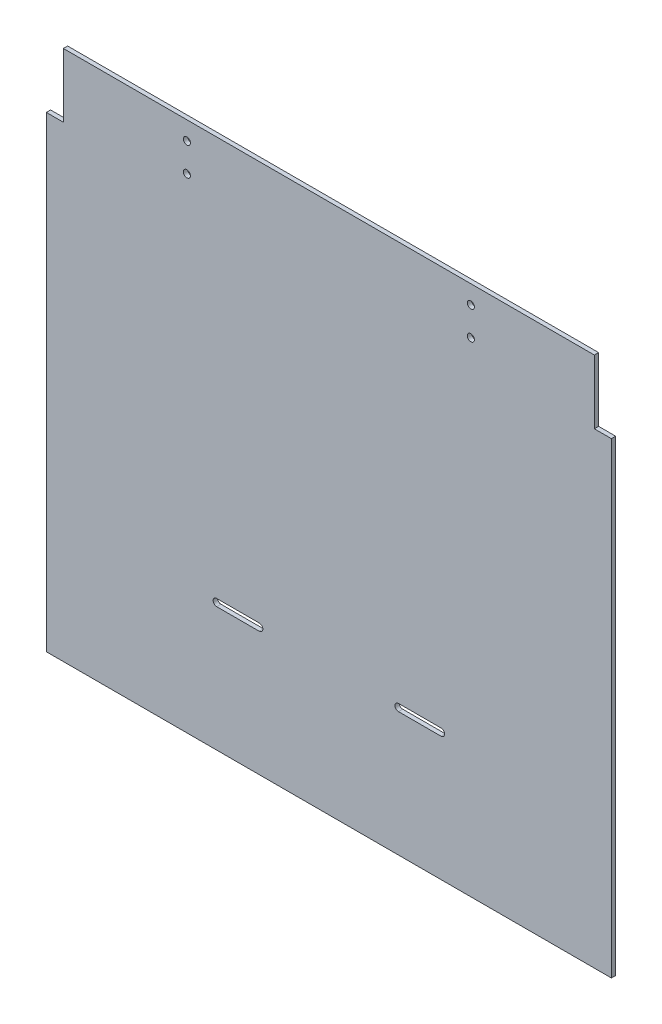
ISO-10303-21;
HEADER;
FILE_DESCRIPTION(('STEP AP214'),'2;1');
FILE_NAME('part.step','',(''),(''),'','','');
FILE_SCHEMA(('AUTOMOTIVE_DESIGN { 1 0 10303 214 1 1 1 1 }'));
ENDSEC;
DATA;
#1=APPLICATION_CONTEXT('core data for automotive mechanical design processes');
#2=APPLICATION_PROTOCOL_DEFINITION('international standard','automotive_design',2000,#1);
#3=PRODUCT_CONTEXT('',#1,'mechanical');
#4=PRODUCT('Part','Part','',(#3));
#5=PRODUCT_RELATED_PRODUCT_CATEGORY('part','',(#4));
#6=PRODUCT_DEFINITION_FORMATION('','',#4);
#7=PRODUCT_DEFINITION_CONTEXT('part definition',#1,'design');
#8=PRODUCT_DEFINITION('design','',#6,#7);
#9=PRODUCT_DEFINITION_SHAPE('','',#8);
#10=(LENGTH_UNIT() NAMED_UNIT(*) SI_UNIT(.MILLI.,.METRE.));
#11=(NAMED_UNIT(*) PLANE_ANGLE_UNIT() SI_UNIT($,.RADIAN.));
#12=(NAMED_UNIT(*) SI_UNIT($,.STERADIAN.) SOLID_ANGLE_UNIT());
#13=UNCERTAINTY_MEASURE_WITH_UNIT(LENGTH_MEASURE(1.E-05),#10,'distance_accuracy_value','');
#14=(GEOMETRIC_REPRESENTATION_CONTEXT(3) GLOBAL_UNCERTAINTY_ASSIGNED_CONTEXT((#13)) GLOBAL_UNIT_ASSIGNED_CONTEXT((#10,
#11,#12)) REPRESENTATION_CONTEXT('',''));
#15=CARTESIAN_POINT('',(0.,0.,0.));
#16=DIRECTION('',(0.,0.,1.));
#17=DIRECTION('',(1.,0.,0.));
#18=AXIS2_PLACEMENT_3D('',#15,#16,#17);
#19=CARTESIAN_POINT('',(199.,-187.,3.));
#20=DIRECTION('',(-1.,0.,0.));
#21=DIRECTION('',(0.,0.,1.));
#22=AXIS2_PLACEMENT_3D('',#19,#20,#21);
#23=PLANE('',#22);
#24=DIRECTION('',(0.,1.,0.));
#25=VECTOR('',#24,1.);
#26=CARTESIAN_POINT('',(199.,-187.,0.));
#27=LINE('',#26,#25);
#28=CARTESIAN_POINT('',(199.,-187.,0.));
#29=VERTEX_POINT('',#28);
#30=CARTESIAN_POINT('',(199.,142.,0.));
#31=VERTEX_POINT('',#30);
#32=EDGE_CURVE('E237',#29,#31,#27,.T.);
#33=ORIENTED_EDGE('',*,*,#32,.T.);
#34=DIRECTION('',(0.,0.,-1.));
#35=VECTOR('',#34,1.);
#36=CARTESIAN_POINT('',(199.,142.,3.001));
#37=LINE('',#36,#35);
#38=CARTESIAN_POINT('',(199.,142.,3.));
#39=VERTEX_POINT('',#38);
#40=EDGE_CURVE('E228',#39,#31,#37,.T.);
#41=ORIENTED_EDGE('',*,*,#40,.F.);
#42=DIRECTION('',(0.,1.,0.));
#43=VECTOR('',#42,1.);
#44=CARTESIAN_POINT('',(199.,-187.,3.));
#45=LINE('',#44,#43);
#46=CARTESIAN_POINT('',(199.,-187.,3.));
#47=VERTEX_POINT('',#46);
#48=EDGE_CURVE('E277',#47,#39,#45,.T.);
#49=ORIENTED_EDGE('',*,*,#48,.F.);
#50=DIRECTION('',(0.,0.,-1.));
#51=VECTOR('',#50,1.);
#52=CARTESIAN_POINT('',(199.,-187.,3.));
#53=LINE('',#52,#51);
#54=EDGE_CURVE('E40',#47,#29,#53,.T.);
#55=ORIENTED_EDGE('',*,*,#54,.T.);
#56=EDGE_LOOP('',(#33,#41,#49,#55));
#57=FACE_BOUND('',#56,.T.);
#58=ADVANCED_FACE('F33',(#57),#23,.F.);
#59=CARTESIAN_POINT('',(-199.,187.,3.));
#60=DIRECTION('',(0.,-1.,0.));
#61=DIRECTION('',(0.,0.,-1.));
#62=AXIS2_PLACEMENT_3D('',#59,#60,#61);
#63=PLANE('',#62);
#64=DIRECTION('',(-1.,0.,0.));
#65=VECTOR('',#64,1.);
#66=CARTESIAN_POINT('',(-199.,187.,3.));
#67=LINE('',#66,#65);
#68=CARTESIAN_POINT('',(187.,187.,3.));
#69=VERTEX_POINT('',#68);
#70=CARTESIAN_POINT('',(-187.,187.,3.));
#71=VERTEX_POINT('',#70);
#72=EDGE_CURVE('E280',#69,#71,#67,.T.);
#73=ORIENTED_EDGE('',*,*,#72,.F.);
#74=DIRECTION('',(0.,0.,-1.));
#75=VECTOR('',#74,1.);
#76=CARTESIAN_POINT('',(187.,187.,3.001));
#77=LINE('',#76,#75);
#78=CARTESIAN_POINT('',(187.,187.,0.));
#79=VERTEX_POINT('',#78);
#80=EDGE_CURVE('E229',#69,#79,#77,.T.);
#81=ORIENTED_EDGE('',*,*,#80,.T.);
#82=DIRECTION('',(-1.,0.,0.));
#83=VECTOR('',#82,1.);
#84=CARTESIAN_POINT('',(-199.,187.,0.));
#85=LINE('',#84,#83);
#86=CARTESIAN_POINT('',(-187.,187.,0.));
#87=VERTEX_POINT('',#86);
#88=EDGE_CURVE('E290',#79,#87,#85,.T.);
#89=ORIENTED_EDGE('',*,*,#88,.T.);
#90=DIRECTION('',(0.,0.,-1.));
#91=VECTOR('',#90,1.);
#92=CARTESIAN_POINT('',(-187.,187.,3.001));
#93=LINE('',#92,#91);
#94=EDGE_CURVE('E269',#71,#87,#93,.T.);
#95=ORIENTED_EDGE('',*,*,#94,.F.);
#96=EDGE_LOOP('',(#73,#81,#89,#95));
#97=FACE_BOUND('',#96,.T.);
#98=ADVANCED_FACE('F332',(#97),#63,.F.);
#99=CARTESIAN_POINT('',(-199.,-187.,3.));
#100=DIRECTION('',(1.,0.,0.));
#101=DIRECTION('',(0.,0.,-1.));
#102=AXIS2_PLACEMENT_3D('',#99,#100,#101);
#103=PLANE('',#102);
#104=DIRECTION('',(0.,-1.,0.));
#105=VECTOR('',#104,1.);
#106=CARTESIAN_POINT('',(-199.,-187.,3.));
#107=LINE('',#106,#105);
#108=CARTESIAN_POINT('',(-199.,142.,3.));
#109=VERTEX_POINT('',#108);
#110=CARTESIAN_POINT('',(-199.,-187.,3.));
#111=VERTEX_POINT('',#110);
#112=EDGE_CURVE('E284',#109,#111,#107,.T.);
#113=ORIENTED_EDGE('',*,*,#112,.F.);
#114=DIRECTION('',(0.,0.,-1.));
#115=VECTOR('',#114,1.);
#116=CARTESIAN_POINT('',(-199.,142.,3.001));
#117=LINE('',#116,#115);
#118=CARTESIAN_POINT('',(-199.,142.,0.));
#119=VERTEX_POINT('',#118);
#120=EDGE_CURVE('E270',#109,#119,#117,.T.);
#121=ORIENTED_EDGE('',*,*,#120,.T.);
#122=DIRECTION('',(0.,-1.,0.));
#123=VECTOR('',#122,1.);
#124=CARTESIAN_POINT('',(-199.,-187.,0.));
#125=LINE('',#124,#123);
#126=CARTESIAN_POINT('',(-199.,-187.,0.));
#127=VERTEX_POINT('',#126);
#128=EDGE_CURVE('E293',#119,#127,#125,.T.);
#129=ORIENTED_EDGE('',*,*,#128,.T.);
#130=DIRECTION('',(0.,0.,-1.));
#131=VECTOR('',#130,1.);
#132=CARTESIAN_POINT('',(-199.,-187.,3.));
#133=LINE('',#132,#131);
#134=EDGE_CURVE('E11',#111,#127,#133,.T.);
#135=ORIENTED_EDGE('',*,*,#134,.F.);
#136=EDGE_LOOP('',(#113,#121,#129,#135));
#137=FACE_BOUND('',#136,.T.);
#138=ADVANCED_FACE('F321',(#137),#103,.F.);
#139=CARTESIAN_POINT('',(-199.,-187.,3.));
#140=DIRECTION('',(0.,1.,0.));
#141=DIRECTION('',(0.,0.,1.));
#142=AXIS2_PLACEMENT_3D('',#139,#140,#141);
#143=PLANE('',#142);
#144=DIRECTION('',(1.,0.,0.));
#145=VECTOR('',#144,1.);
#146=CARTESIAN_POINT('',(-199.,-187.,0.));
#147=LINE('',#146,#145);
#148=EDGE_CURVE('E281',#127,#29,#147,.T.);
#149=ORIENTED_EDGE('',*,*,#148,.T.);
#150=ORIENTED_EDGE('',*,*,#54,.F.);
#151=DIRECTION('',(1.,0.,0.));
#152=VECTOR('',#151,1.);
#153=CARTESIAN_POINT('',(-199.,-187.,3.));
#154=LINE('',#153,#152);
#155=EDGE_CURVE('E286',#111,#47,#154,.T.);
#156=ORIENTED_EDGE('',*,*,#155,.F.);
#157=ORIENTED_EDGE('',*,*,#134,.T.);
#158=EDGE_LOOP('',(#149,#150,#156,#157));
#159=FACE_BOUND('',#158,.T.);
#160=ADVANCED_FACE('F319',(#159),#143,.F.);
#161=CARTESIAN_POINT('',(0.,0.,3.));
#162=DIRECTION('',(0.,0.,-1.));
#163=DIRECTION('',(-1.,0.,0.));
#164=AXIS2_PLACEMENT_3D('',#161,#162,#163);
#165=PLANE('',#164);
#166=CARTESIAN_POINT('',(-79.0000000000001,-97.0000000000001,3.));
#167=DIRECTION('',(0.,0.,-1.));
#168=DIRECTION('',(-1.,0.,0.));
#169=AXIS2_PLACEMENT_3D('',#166,#167,#168);
#170=CIRCLE('',#169,2.5);
#171=CARTESIAN_POINT('',(-79.0000000000001,-99.5000000000001,3.));
#172=VERTEX_POINT('',#171);
#173=CARTESIAN_POINT('',(-79.0000000000001,-94.5000000000001,3.));
#174=VERTEX_POINT('',#173);
#175=EDGE_CURVE('E47',#172,#174,#170,.T.);
#176=ORIENTED_EDGE('',*,*,#175,.T.);
#177=DIRECTION('',(1.,0.,0.));
#178=VECTOR('',#177,1.);
#179=CARTESIAN_POINT('',(-49.0000000000001,-94.5000000000001,3.));
#180=LINE('',#179,#178);
#181=CARTESIAN_POINT('',(-49.0000000000001,-94.5000000000001,3.));
#182=VERTEX_POINT('',#181);
#183=EDGE_CURVE('E166',#174,#182,#180,.T.);
#184=ORIENTED_EDGE('',*,*,#183,.T.);
#185=CARTESIAN_POINT('',(-49.0000000000001,-97.0000000000001,3.));
#186=DIRECTION('',(0.,0.,-1.));
#187=DIRECTION('',(-1.,0.,0.));
#188=AXIS2_PLACEMENT_3D('',#185,#186,#187);
#189=CIRCLE('',#188,2.5);
#190=CARTESIAN_POINT('',(-49.0000000000001,-99.5000000000001,3.));
#191=VERTEX_POINT('',#190);
#192=EDGE_CURVE('E156',#182,#191,#189,.T.);
#193=ORIENTED_EDGE('',*,*,#192,.T.);
#194=DIRECTION('',(-1.,0.,0.));
#195=VECTOR('',#194,1.);
#196=CARTESIAN_POINT('',(-49.0000000000001,-99.5000000000001,3.));
#197=LINE('',#196,#195);
#198=EDGE_CURVE('E148',#191,#172,#197,.T.);
#199=ORIENTED_EDGE('',*,*,#198,.T.);
#200=EDGE_LOOP('',(#176,#184,#193,#199));
#201=FACE_BOUND('',#200,.T.);
#202=CARTESIAN_POINT('',(79.0000000000007,-97.0000000000005,3.));
#203=DIRECTION('',(0.,0.,-1.));
#204=DIRECTION('',(1.,0.,0.));
#205=AXIS2_PLACEMENT_3D('',#202,#203,#204);
#206=CIRCLE('',#205,2.5);
#207=CARTESIAN_POINT('',(79.0000000000008,-94.5000000000005,3.));
#208=VERTEX_POINT('',#207);
#209=CARTESIAN_POINT('',(79.0000000000007,-99.5000000000005,3.));
#210=VERTEX_POINT('',#209);
#211=EDGE_CURVE('E55',#208,#210,#206,.T.);
#212=ORIENTED_EDGE('',*,*,#211,.T.);
#213=DIRECTION('',(-1.,0.,0.));
#214=VECTOR('',#213,1.);
#215=CARTESIAN_POINT('',(49.0000000000007,-99.5000000000005,3.));
#216=LINE('',#215,#214);
#217=CARTESIAN_POINT('',(49.0000000000007,-99.5000000000005,3.));
#218=VERTEX_POINT('',#217);
#219=EDGE_CURVE('E198',#210,#218,#216,.T.);
#220=ORIENTED_EDGE('',*,*,#219,.T.);
#221=CARTESIAN_POINT('',(49.0000000000007,-97.0000000000005,3.));
#222=DIRECTION('',(0.,0.,-1.));
#223=DIRECTION('',(1.,0.,0.));
#224=AXIS2_PLACEMENT_3D('',#221,#222,#223);
#225=CIRCLE('',#224,2.5);
#226=CARTESIAN_POINT('',(49.0000000000008,-94.5000000000005,3.));
#227=VERTEX_POINT('',#226);
#228=EDGE_CURVE('E190',#218,#227,#225,.T.);
#229=ORIENTED_EDGE('',*,*,#228,.T.);
#230=DIRECTION('',(1.,0.,0.));
#231=VECTOR('',#230,1.);
#232=CARTESIAN_POINT('',(49.0000000000008,-94.5000000000005,3.));
#233=LINE('',#232,#231);
#234=EDGE_CURVE('E193',#227,#208,#233,.T.);
#235=ORIENTED_EDGE('',*,*,#234,.T.);
#236=EDGE_LOOP('',(#212,#220,#229,#235));
#237=FACE_BOUND('',#236,.T.);
#238=CARTESIAN_POINT('',(100.,174.06,3.));
#239=DIRECTION('',(0.,0.,-1.));
#240=DIRECTION('',(-1.,0.,0.));
#241=AXIS2_PLACEMENT_3D('',#238,#239,#240);
#242=CIRCLE('',#241,2.5);
#243=CARTESIAN_POINT('',(97.5,174.06,3.));
#244=VERTEX_POINT('',#243);
#245=EDGE_CURVE('E223',#244,#244,#242,.F.);
#246=ORIENTED_EDGE('',*,*,#245,.F.);
#247=EDGE_LOOP('',(#246));
#248=FACE_BOUND('',#247,.T.);
#249=CARTESIAN_POINT('',(100.,154.06,3.));
#250=DIRECTION('',(0.,0.,-1.));
#251=DIRECTION('',(-1.,0.,0.));
#252=AXIS2_PLACEMENT_3D('',#249,#250,#251);
#253=CIRCLE('',#252,2.5);
#254=CARTESIAN_POINT('',(97.5,154.06,3.));
#255=VERTEX_POINT('',#254);
#256=EDGE_CURVE('E241',#255,#255,#253,.F.);
#257=ORIENTED_EDGE('',*,*,#256,.F.);
#258=EDGE_LOOP('',(#257));
#259=FACE_BOUND('',#258,.T.);
#260=CARTESIAN_POINT('',(-100.,154.06,3.));
#261=DIRECTION('',(0.,0.,-1.));
#262=DIRECTION('',(-1.,0.,0.));
#263=AXIS2_PLACEMENT_3D('',#260,#261,#262);
#264=CIRCLE('',#263,2.5);
#265=CARTESIAN_POINT('',(-102.5,154.06,3.));
#266=VERTEX_POINT('',#265);
#267=EDGE_CURVE('E247',#266,#266,#264,.F.);
#268=ORIENTED_EDGE('',*,*,#267,.F.);
#269=EDGE_LOOP('',(#268));
#270=FACE_BOUND('',#269,.T.);
#271=CARTESIAN_POINT('',(-100.,174.06,3.));
#272=DIRECTION('',(0.,0.,-1.));
#273=DIRECTION('',(-1.,0.,0.));
#274=AXIS2_PLACEMENT_3D('',#271,#272,#273);
#275=CIRCLE('',#274,2.5);
#276=CARTESIAN_POINT('',(-102.5,174.06,3.));
#277=VERTEX_POINT('',#276);
#278=EDGE_CURVE('E253',#277,#277,#275,.F.);
#279=ORIENTED_EDGE('',*,*,#278,.F.);
#280=EDGE_LOOP('',(#279));
#281=FACE_BOUND('',#280,.T.);
#282=DIRECTION('',(1.,0.,0.));
#283=VECTOR('',#282,1.);
#284=CARTESIAN_POINT('',(199.,142.,3.));
#285=LINE('',#284,#283);
#286=CARTESIAN_POINT('',(187.,142.,3.));
#287=VERTEX_POINT('',#286);
#288=EDGE_CURVE('E232',#287,#39,#285,.T.);
#289=ORIENTED_EDGE('',*,*,#288,.F.);
#290=DIRECTION('',(0.,-1.,0.));
#291=VECTOR('',#290,1.);
#292=CARTESIAN_POINT('',(187.,187.,3.));
#293=LINE('',#292,#291);
#294=EDGE_CURVE('E219',#69,#287,#293,.T.);
#295=ORIENTED_EDGE('',*,*,#294,.F.);
#296=ORIENTED_EDGE('',*,*,#72,.T.);
#297=DIRECTION('',(0.,1.,0.));
#298=VECTOR('',#297,1.);
#299=CARTESIAN_POINT('',(-187.,187.,3.));
#300=LINE('',#299,#298);
#301=CARTESIAN_POINT('',(-187.,142.,3.));
#302=VERTEX_POINT('',#301);
#303=EDGE_CURVE('E259',#302,#71,#300,.T.);
#304=ORIENTED_EDGE('',*,*,#303,.F.);
#305=DIRECTION('',(1.,0.,0.));
#306=VECTOR('',#305,1.);
#307=CARTESIAN_POINT('',(-199.,142.,3.));
#308=LINE('',#307,#306);
#309=EDGE_CURVE('E185',#109,#302,#308,.T.);
#310=ORIENTED_EDGE('',*,*,#309,.F.);
#311=ORIENTED_EDGE('',*,*,#112,.T.);
#312=ORIENTED_EDGE('',*,*,#155,.T.);
#313=ORIENTED_EDGE('',*,*,#48,.T.);
#314=EDGE_LOOP('',(#289,#295,#296,#304,#310,#311,#312,#313));
#315=FACE_BOUND('',#314,.T.);
#316=ADVANCED_FACE('F168',(#201,#237,#248,#259,#270,#281,#315),#165,.F.);
#317=CARTESIAN_POINT('',(0.,0.,0.));
#318=DIRECTION('',(0.,0.,-1.));
#319=DIRECTION('',(-1.,0.,0.));
#320=AXIS2_PLACEMENT_3D('',#317,#318,#319);
#321=PLANE('',#320);
#322=DIRECTION('',(1.,0.,0.));
#323=VECTOR('',#322,1.);
#324=CARTESIAN_POINT('',(-49.0000000000001,-94.5000000000001,0.));
#325=LINE('',#324,#323);
#326=CARTESIAN_POINT('',(-79.0000000000001,-94.5000000000001,0.));
#327=VERTEX_POINT('',#326);
#328=CARTESIAN_POINT('',(-49.0000000000001,-94.5000000000001,0.));
#329=VERTEX_POINT('',#328);
#330=EDGE_CURVE('E170',#327,#329,#325,.T.);
#331=ORIENTED_EDGE('',*,*,#330,.F.);
#332=CARTESIAN_POINT('',(-79.0000000000001,-97.0000000000001,0.));
#333=DIRECTION('',(0.,0.,-1.));
#334=DIRECTION('',(-1.,0.,0.));
#335=AXIS2_PLACEMENT_3D('',#332,#333,#334);
#336=CIRCLE('',#335,2.5);
#337=CARTESIAN_POINT('',(-79.0000000000001,-99.5000000000001,0.));
#338=VERTEX_POINT('',#337);
#339=EDGE_CURVE('E172',#338,#327,#336,.T.);
#340=ORIENTED_EDGE('',*,*,#339,.F.);
#341=DIRECTION('',(-1.,0.,0.));
#342=VECTOR('',#341,1.);
#343=CARTESIAN_POINT('',(-49.0000000000001,-99.5000000000001,0.));
#344=LINE('',#343,#342);
#345=CARTESIAN_POINT('',(-49.0000000000001,-99.5000000000001,0.));
#346=VERTEX_POINT('',#345);
#347=EDGE_CURVE('E178',#346,#338,#344,.T.);
#348=ORIENTED_EDGE('',*,*,#347,.F.);
#349=CARTESIAN_POINT('',(-49.0000000000001,-97.0000000000001,0.));
#350=DIRECTION('',(0.,0.,-1.));
#351=DIRECTION('',(-1.,0.,0.));
#352=AXIS2_PLACEMENT_3D('',#349,#350,#351);
#353=CIRCLE('',#352,2.5);
#354=EDGE_CURVE('E164',#329,#346,#353,.T.);
#355=ORIENTED_EDGE('',*,*,#354,.F.);
#356=EDGE_LOOP('',(#331,#340,#348,#355));
#357=FACE_BOUND('',#356,.T.);
#358=DIRECTION('',(-1.,0.,0.));
#359=VECTOR('',#358,1.);
#360=CARTESIAN_POINT('',(49.0000000000007,-99.5000000000005,0.));
#361=LINE('',#360,#359);
#362=CARTESIAN_POINT('',(79.0000000000007,-99.5000000000005,0.));
#363=VERTEX_POINT('',#362);
#364=CARTESIAN_POINT('',(49.0000000000007,-99.5000000000005,0.));
#365=VERTEX_POINT('',#364);
#366=EDGE_CURVE('E194',#363,#365,#361,.T.);
#367=ORIENTED_EDGE('',*,*,#366,.F.);
#368=CARTESIAN_POINT('',(79.0000000000007,-97.0000000000005,0.));
#369=DIRECTION('',(0.,0.,-1.));
#370=DIRECTION('',(1.,0.,0.));
#371=AXIS2_PLACEMENT_3D('',#368,#369,#370);
#372=CIRCLE('',#371,2.5);
#373=CARTESIAN_POINT('',(79.0000000000008,-94.5000000000005,0.));
#374=VERTEX_POINT('',#373);
#375=EDGE_CURVE('E207',#374,#363,#372,.T.);
#376=ORIENTED_EDGE('',*,*,#375,.F.);
#377=DIRECTION('',(1.,0.,0.));
#378=VECTOR('',#377,1.);
#379=CARTESIAN_POINT('',(49.0000000000008,-94.5000000000005,0.));
#380=LINE('',#379,#378);
#381=CARTESIAN_POINT('',(49.0000000000008,-94.5000000000005,0.));
#382=VERTEX_POINT('',#381);
#383=EDGE_CURVE('E205',#382,#374,#380,.T.);
#384=ORIENTED_EDGE('',*,*,#383,.F.);
#385=CARTESIAN_POINT('',(49.0000000000007,-97.0000000000005,0.));
#386=DIRECTION('',(0.,0.,-1.));
#387=DIRECTION('',(1.,0.,0.));
#388=AXIS2_PLACEMENT_3D('',#385,#386,#387);
#389=CIRCLE('',#388,2.5);
#390=EDGE_CURVE('E202',#365,#382,#389,.T.);
#391=ORIENTED_EDGE('',*,*,#390,.F.);
#392=EDGE_LOOP('',(#367,#376,#384,#391));
#393=FACE_BOUND('',#392,.T.);
#394=DIRECTION('',(0.,1.,0.));
#395=VECTOR('',#394,1.);
#396=CARTESIAN_POINT('',(187.,187.,0.));
#397=LINE('',#396,#395);
#398=CARTESIAN_POINT('',(187.,142.,0.));
#399=VERTEX_POINT('',#398);
#400=EDGE_CURVE('E226',#399,#79,#397,.T.);
#401=ORIENTED_EDGE('',*,*,#400,.F.);
#402=DIRECTION('',(-1.,0.,0.));
#403=VECTOR('',#402,1.);
#404=CARTESIAN_POINT('',(199.,142.,0.));
#405=LINE('',#404,#403);
#406=EDGE_CURVE('E222',#31,#399,#405,.T.);
#407=ORIENTED_EDGE('',*,*,#406,.F.);
#408=ORIENTED_EDGE('',*,*,#32,.F.);
#409=ORIENTED_EDGE('',*,*,#148,.F.);
#410=ORIENTED_EDGE('',*,*,#128,.F.);
#411=DIRECTION('',(-1.,0.,0.));
#412=VECTOR('',#411,1.);
#413=CARTESIAN_POINT('',(-199.,142.,0.));
#414=LINE('',#413,#412);
#415=CARTESIAN_POINT('',(-187.,142.,0.));
#416=VERTEX_POINT('',#415);
#417=EDGE_CURVE('E267',#416,#119,#414,.T.);
#418=ORIENTED_EDGE('',*,*,#417,.F.);
#419=DIRECTION('',(0.,-1.,0.));
#420=VECTOR('',#419,1.);
#421=CARTESIAN_POINT('',(-187.,187.,0.));
#422=LINE('',#421,#420);
#423=EDGE_CURVE('E264',#87,#416,#422,.T.);
#424=ORIENTED_EDGE('',*,*,#423,.F.);
#425=ORIENTED_EDGE('',*,*,#88,.F.);
#426=EDGE_LOOP('',(#401,#407,#408,#409,#410,#418,#424,#425));
#427=FACE_BOUND('',#426,.T.);
#428=CARTESIAN_POINT('',(100.,174.06,0.));
#429=DIRECTION('',(0.,0.,-1.));
#430=DIRECTION('',(-1.,0.,0.));
#431=AXIS2_PLACEMENT_3D('',#428,#429,#430);
#432=CIRCLE('',#431,2.5);
#433=CARTESIAN_POINT('',(97.5,174.06,0.));
#434=VERTEX_POINT('',#433);
#435=EDGE_CURVE('E238',#434,#434,#432,.T.);
#436=ORIENTED_EDGE('',*,*,#435,.F.);
#437=EDGE_LOOP('',(#436));
#438=FACE_BOUND('',#437,.T.);
#439=CARTESIAN_POINT('',(100.,154.06,0.));
#440=DIRECTION('',(0.,0.,-1.));
#441=DIRECTION('',(1.,0.,0.));
#442=AXIS2_PLACEMENT_3D('',#439,#440,#441);
#443=CIRCLE('',#442,2.5);
#444=CARTESIAN_POINT('',(97.5,154.06,0.));
#445=VERTEX_POINT('',#444);
#446=EDGE_CURVE('E244',#445,#445,#443,.T.);
#447=ORIENTED_EDGE('',*,*,#446,.F.);
#448=EDGE_LOOP('',(#447));
#449=FACE_BOUND('',#448,.T.);
#450=CARTESIAN_POINT('',(-100.,154.06,0.));
#451=DIRECTION('',(0.,0.,-1.));
#452=DIRECTION('',(-1.,0.,0.));
#453=AXIS2_PLACEMENT_3D('',#450,#451,#452);
#454=CIRCLE('',#453,2.5);
#455=CARTESIAN_POINT('',(-102.5,154.06,0.));
#456=VERTEX_POINT('',#455);
#457=EDGE_CURVE('E250',#456,#456,#454,.T.);
#458=ORIENTED_EDGE('',*,*,#457,.F.);
#459=EDGE_LOOP('',(#458));
#460=FACE_BOUND('',#459,.T.);
#461=CARTESIAN_POINT('',(-100.,174.06,0.));
#462=DIRECTION('',(0.,0.,-1.));
#463=DIRECTION('',(1.,0.,0.));
#464=AXIS2_PLACEMENT_3D('',#461,#462,#463);
#465=CIRCLE('',#464,2.5);
#466=CARTESIAN_POINT('',(-102.5,174.06,0.));
#467=VERTEX_POINT('',#466);
#468=EDGE_CURVE('E256',#467,#467,#465,.T.);
#469=ORIENTED_EDGE('',*,*,#468,.F.);
#470=EDGE_LOOP('',(#469));
#471=FACE_BOUND('',#470,.T.);
#472=ADVANCED_FACE('F307',(#357,#393,#427,#438,#449,#460,#471),#321,.T.);
#473=CARTESIAN_POINT('',(-199.,142.,3.001));
#474=DIRECTION('',(0.,-1.,0.));
#475=DIRECTION('',(1.,0.,0.));
#476=AXIS2_PLACEMENT_3D('',#473,#474,#475);
#477=PLANE('',#476);
#478=ORIENTED_EDGE('',*,*,#309,.T.);
#479=DIRECTION('',(0.,0.,-1.));
#480=VECTOR('',#479,1.);
#481=CARTESIAN_POINT('',(-187.,142.,3.001));
#482=LINE('',#481,#480);
#483=EDGE_CURVE('E273',#302,#416,#482,.T.);
#484=ORIENTED_EDGE('',*,*,#483,.T.);
#485=ORIENTED_EDGE('',*,*,#417,.T.);
#486=ORIENTED_EDGE('',*,*,#120,.F.);
#487=EDGE_LOOP('',(#478,#484,#485,#486));
#488=FACE_BOUND('',#487,.T.);
#489=ADVANCED_FACE('F325',(#488),#477,.F.);
#490=CARTESIAN_POINT('',(-187.,187.,3.001));
#491=DIRECTION('',(1.,0.,0.));
#492=DIRECTION('',(0.,0.,-1.));
#493=AXIS2_PLACEMENT_3D('',#490,#491,#492);
#494=PLANE('',#493);
#495=ORIENTED_EDGE('',*,*,#303,.T.);
#496=ORIENTED_EDGE('',*,*,#94,.T.);
#497=ORIENTED_EDGE('',*,*,#423,.T.);
#498=ORIENTED_EDGE('',*,*,#483,.F.);
#499=EDGE_LOOP('',(#495,#496,#497,#498));
#500=FACE_BOUND('',#499,.T.);
#501=ADVANCED_FACE('F328',(#500),#494,.F.);
#502=CARTESIAN_POINT('',(-100.,174.06,3.001));
#503=DIRECTION('',(0.,0.,-1.));
#504=DIRECTION('',(-1.,0.,0.));
#505=AXIS2_PLACEMENT_3D('',#502,#503,#504);
#506=CYLINDRICAL_SURFACE('',#505,2.5);
#507=CARTESIAN_POINT('',(-102.5,174.06,0.));
#508=CARTESIAN_POINT('',(-102.5,174.06,0.0312500000000005));
#509=CARTESIAN_POINT('',(-102.5,174.06,0.0625000000000005));
#510=CARTESIAN_POINT('',(-102.5,174.06,0.125000000000001));
#511=CARTESIAN_POINT('',(-102.5,174.06,0.156250000000001));
#512=CARTESIAN_POINT('',(-102.5,174.06,0.218750000000001));
#513=CARTESIAN_POINT('',(-102.5,174.06,0.250000000000001));
#514=CARTESIAN_POINT('',(-102.5,174.06,0.312500000000001));
#515=CARTESIAN_POINT('',(-102.5,174.06,0.34375));
#516=CARTESIAN_POINT('',(-102.5,174.06,0.40625));
#517=CARTESIAN_POINT('',(-102.5,174.06,0.4375));
#518=CARTESIAN_POINT('',(-102.5,174.06,0.5));
#519=CARTESIAN_POINT('',(-102.5,174.06,0.53125));
#520=CARTESIAN_POINT('',(-102.5,174.06,0.593750000000001));
#521=CARTESIAN_POINT('',(-102.5,174.06,0.625000000000001));
#522=CARTESIAN_POINT('',(-102.5,174.06,0.687500000000001));
#523=CARTESIAN_POINT('',(-102.5,174.06,0.71875));
#524=CARTESIAN_POINT('',(-102.5,174.06,0.78125));
#525=CARTESIAN_POINT('',(-102.5,174.06,0.8125));
#526=CARTESIAN_POINT('',(-102.5,174.06,0.875));
#527=CARTESIAN_POINT('',(-102.5,174.06,0.90625));
#528=CARTESIAN_POINT('',(-102.5,174.06,0.96875));
#529=CARTESIAN_POINT('',(-102.5,174.06,1.));
#530=CARTESIAN_POINT('',(-102.5,174.06,1.0625));
#531=CARTESIAN_POINT('',(-102.5,174.06,1.09375));
#532=CARTESIAN_POINT('',(-102.5,174.06,1.15625));
#533=CARTESIAN_POINT('',(-102.5,174.06,1.1875));
#534=CARTESIAN_POINT('',(-102.5,174.06,1.25));
#535=CARTESIAN_POINT('',(-102.5,174.06,1.28125));
#536=CARTESIAN_POINT('',(-102.5,174.06,1.34375));
#537=CARTESIAN_POINT('',(-102.5,174.06,1.375));
#538=CARTESIAN_POINT('',(-102.5,174.06,1.4375));
#539=CARTESIAN_POINT('',(-102.5,174.06,1.46875));
#540=CARTESIAN_POINT('',(-102.5,174.06,1.53125));
#541=CARTESIAN_POINT('',(-102.5,174.06,1.5625));
#542=CARTESIAN_POINT('',(-102.5,174.06,1.625));
#543=CARTESIAN_POINT('',(-102.5,174.06,1.65625));
#544=CARTESIAN_POINT('',(-102.5,174.06,1.71875));
#545=CARTESIAN_POINT('',(-102.5,174.06,1.75));
#546=CARTESIAN_POINT('',(-102.5,174.06,1.8125));
#547=CARTESIAN_POINT('',(-102.5,174.06,1.84375));
#548=CARTESIAN_POINT('',(-102.5,174.06,1.90625));
#549=CARTESIAN_POINT('',(-102.5,174.06,1.9375));
#550=CARTESIAN_POINT('',(-102.5,174.06,2.));
#551=CARTESIAN_POINT('',(-102.5,174.06,2.03125));
#552=CARTESIAN_POINT('',(-102.5,174.06,2.09375));
#553=CARTESIAN_POINT('',(-102.5,174.06,2.125));
#554=CARTESIAN_POINT('',(-102.5,174.06,2.1875));
#555=CARTESIAN_POINT('',(-102.5,174.06,2.21875));
#556=CARTESIAN_POINT('',(-102.5,174.06,2.28125));
#557=CARTESIAN_POINT('',(-102.5,174.06,2.3125));
#558=CARTESIAN_POINT('',(-102.5,174.06,2.375));
#559=CARTESIAN_POINT('',(-102.5,174.06,2.40625));
#560=CARTESIAN_POINT('',(-102.5,174.06,2.46875));
#561=CARTESIAN_POINT('',(-102.5,174.06,2.5));
#562=CARTESIAN_POINT('',(-102.5,174.06,2.5625));
#563=CARTESIAN_POINT('',(-102.5,174.06,2.59375));
#564=CARTESIAN_POINT('',(-102.5,174.06,2.65625));
#565=CARTESIAN_POINT('',(-102.5,174.06,2.6875));
#566=CARTESIAN_POINT('',(-102.5,174.06,2.75));
#567=CARTESIAN_POINT('',(-102.5,174.06,2.78125));
#568=CARTESIAN_POINT('',(-102.5,174.06,2.84375));
#569=CARTESIAN_POINT('',(-102.5,174.06,2.875));
#570=CARTESIAN_POINT('',(-102.5,174.06,2.9375));
#571=CARTESIAN_POINT('',(-102.5,174.06,2.96875));
#572=CARTESIAN_POINT('',(-102.5,174.06,3.));
#573=B_SPLINE_CURVE_WITH_KNOTS('',3,(#507,#508,#509,#510,#511,#512,#513,#514,#515,#516,#517,
#518,#519,#520,#521,#522,#523,#524,#525,#526,#527,#528,#529,#530,#531,#532,#533,#534,#535,#536,
#537,#538,#539,#540,#541,#542,#543,#544,#545,#546,#547,#548,#549,#550,#551,#552,#553,#554,#555,
#556,#557,#558,#559,#560,#561,#562,#563,#564,#565,#566,#567,#568,#569,#570,#571,#572),
.UNSPECIFIED.,.F.,.F.,(4,2,2,2,2,2,2,2,2,2,2,2,2,2,2,2,2,2,2,2,2,2,2,2,2,2,2,2,2,2,2,2,4),(0.,
0.0937500000000001,0.1875,0.28125,0.375,0.46875,0.5625,0.65625,0.75,0.84375,0.9375,1.03125,
1.125,1.21875,1.3125,1.40625,1.5,1.59375,1.6875,1.78125,1.875,1.96875,2.0625,2.15625,2.25,
2.34375,2.4375,2.53125,2.625,2.71875,2.8125,2.90625,3.),.UNSPECIFIED.);
#574=EDGE_CURVE('BSEAM366',#467,#277,#573,.T.);
#575=ORIENTED_EDGE('',*,*,#468,.T.);
#576=ORIENTED_EDGE('',*,*,#278,.T.);
#577=ORIENTED_EDGE('',*,*,#574,.T.);
#578=ORIENTED_EDGE('',*,*,#574,.F.);
#579=EDGE_LOOP('',(#575,#577,#576,#578));
#580=FACE_BOUND('',#579,.T.);
#581=ADVANCED_FACE('F366',(#580),#506,.F.);
#582=CARTESIAN_POINT('',(-100.,154.06,3.001));
#583=DIRECTION('',(0.,0.,-1.));
#584=DIRECTION('',(-1.,0.,0.));
#585=AXIS2_PLACEMENT_3D('',#582,#583,#584);
#586=CYLINDRICAL_SURFACE('',#585,2.5);
#587=CARTESIAN_POINT('',(-102.5,154.06,0.));
#588=CARTESIAN_POINT('',(-102.5,154.06,0.0312500000000005));
#589=CARTESIAN_POINT('',(-102.5,154.06,0.0625000000000005));
#590=CARTESIAN_POINT('',(-102.5,154.06,0.125000000000001));
#591=CARTESIAN_POINT('',(-102.5,154.06,0.156250000000001));
#592=CARTESIAN_POINT('',(-102.5,154.06,0.218750000000001));
#593=CARTESIAN_POINT('',(-102.5,154.06,0.250000000000001));
#594=CARTESIAN_POINT('',(-102.5,154.06,0.312500000000001));
#595=CARTESIAN_POINT('',(-102.5,154.06,0.34375));
#596=CARTESIAN_POINT('',(-102.5,154.06,0.40625));
#597=CARTESIAN_POINT('',(-102.5,154.06,0.4375));
#598=CARTESIAN_POINT('',(-102.5,154.06,0.5));
#599=CARTESIAN_POINT('',(-102.5,154.06,0.53125));
#600=CARTESIAN_POINT('',(-102.5,154.06,0.593750000000001));
#601=CARTESIAN_POINT('',(-102.5,154.06,0.625000000000001));
#602=CARTESIAN_POINT('',(-102.5,154.06,0.687500000000001));
#603=CARTESIAN_POINT('',(-102.5,154.06,0.71875));
#604=CARTESIAN_POINT('',(-102.5,154.06,0.78125));
#605=CARTESIAN_POINT('',(-102.5,154.06,0.8125));
#606=CARTESIAN_POINT('',(-102.5,154.06,0.875));
#607=CARTESIAN_POINT('',(-102.5,154.06,0.90625));
#608=CARTESIAN_POINT('',(-102.5,154.06,0.96875));
#609=CARTESIAN_POINT('',(-102.5,154.06,1.));
#610=CARTESIAN_POINT('',(-102.5,154.06,1.0625));
#611=CARTESIAN_POINT('',(-102.5,154.06,1.09375));
#612=CARTESIAN_POINT('',(-102.5,154.06,1.15625));
#613=CARTESIAN_POINT('',(-102.5,154.06,1.1875));
#614=CARTESIAN_POINT('',(-102.5,154.06,1.25));
#615=CARTESIAN_POINT('',(-102.5,154.06,1.28125));
#616=CARTESIAN_POINT('',(-102.5,154.06,1.34375));
#617=CARTESIAN_POINT('',(-102.5,154.06,1.375));
#618=CARTESIAN_POINT('',(-102.5,154.06,1.4375));
#619=CARTESIAN_POINT('',(-102.5,154.06,1.46875));
#620=CARTESIAN_POINT('',(-102.5,154.06,1.53125));
#621=CARTESIAN_POINT('',(-102.5,154.06,1.5625));
#622=CARTESIAN_POINT('',(-102.5,154.06,1.625));
#623=CARTESIAN_POINT('',(-102.5,154.06,1.65625));
#624=CARTESIAN_POINT('',(-102.5,154.06,1.71875));
#625=CARTESIAN_POINT('',(-102.5,154.06,1.75));
#626=CARTESIAN_POINT('',(-102.5,154.06,1.8125));
#627=CARTESIAN_POINT('',(-102.5,154.06,1.84375));
#628=CARTESIAN_POINT('',(-102.5,154.06,1.90625));
#629=CARTESIAN_POINT('',(-102.5,154.06,1.9375));
#630=CARTESIAN_POINT('',(-102.5,154.06,2.));
#631=CARTESIAN_POINT('',(-102.5,154.06,2.03125));
#632=CARTESIAN_POINT('',(-102.5,154.06,2.09375));
#633=CARTESIAN_POINT('',(-102.5,154.06,2.125));
#634=CARTESIAN_POINT('',(-102.5,154.06,2.1875));
#635=CARTESIAN_POINT('',(-102.5,154.06,2.21875));
#636=CARTESIAN_POINT('',(-102.5,154.06,2.28125));
#637=CARTESIAN_POINT('',(-102.5,154.06,2.3125));
#638=CARTESIAN_POINT('',(-102.5,154.06,2.375));
#639=CARTESIAN_POINT('',(-102.5,154.06,2.40625));
#640=CARTESIAN_POINT('',(-102.5,154.06,2.46875));
#641=CARTESIAN_POINT('',(-102.5,154.06,2.5));
#642=CARTESIAN_POINT('',(-102.5,154.06,2.5625));
#643=CARTESIAN_POINT('',(-102.5,154.06,2.59375));
#644=CARTESIAN_POINT('',(-102.5,154.06,2.65625));
#645=CARTESIAN_POINT('',(-102.5,154.06,2.6875));
#646=CARTESIAN_POINT('',(-102.5,154.06,2.75));
#647=CARTESIAN_POINT('',(-102.5,154.06,2.78125));
#648=CARTESIAN_POINT('',(-102.5,154.06,2.84375));
#649=CARTESIAN_POINT('',(-102.5,154.06,2.875));
#650=CARTESIAN_POINT('',(-102.5,154.06,2.9375));
#651=CARTESIAN_POINT('',(-102.5,154.06,2.96875));
#652=CARTESIAN_POINT('',(-102.5,154.06,3.));
#653=B_SPLINE_CURVE_WITH_KNOTS('',3,(#587,#588,#589,#590,#591,#592,#593,#594,#595,#596,#597,
#598,#599,#600,#601,#602,#603,#604,#605,#606,#607,#608,#609,#610,#611,#612,#613,#614,#615,#616,
#617,#618,#619,#620,#621,#622,#623,#624,#625,#626,#627,#628,#629,#630,#631,#632,#633,#634,#635,
#636,#637,#638,#639,#640,#641,#642,#643,#644,#645,#646,#647,#648,#649,#650,#651,#652),
.UNSPECIFIED.,.F.,.F.,(4,2,2,2,2,2,2,2,2,2,2,2,2,2,2,2,2,2,2,2,2,2,2,2,2,2,2,2,2,2,2,2,4),(0.,
0.0937500000000001,0.1875,0.28125,0.375,0.46875,0.5625,0.65625,0.75,0.84375,0.9375,1.03125,
1.125,1.21875,1.3125,1.40625,1.5,1.59375,1.6875,1.78125,1.875,1.96875,2.0625,2.15625,2.25,
2.34375,2.4375,2.53125,2.625,2.71875,2.8125,2.90625,3.),.UNSPECIFIED.);
#654=EDGE_CURVE('BSEAM371',#456,#266,#653,.T.);
#655=ORIENTED_EDGE('',*,*,#457,.T.);
#656=ORIENTED_EDGE('',*,*,#267,.T.);
#657=ORIENTED_EDGE('',*,*,#654,.T.);
#658=ORIENTED_EDGE('',*,*,#654,.F.);
#659=EDGE_LOOP('',(#655,#657,#656,#658));
#660=FACE_BOUND('',#659,.T.);
#661=ADVANCED_FACE('F371',(#660),#586,.F.);
#662=CARTESIAN_POINT('',(100.,154.06,3.001));
#663=DIRECTION('',(0.,0.,-1.));
#664=DIRECTION('',(-1.,0.,0.));
#665=AXIS2_PLACEMENT_3D('',#662,#663,#664);
#666=CYLINDRICAL_SURFACE('',#665,2.5);
#667=CARTESIAN_POINT('',(97.5,154.06,0.));
#668=CARTESIAN_POINT('',(97.5,154.06,0.0312500000000005));
#669=CARTESIAN_POINT('',(97.5,154.06,0.0625000000000005));
#670=CARTESIAN_POINT('',(97.5,154.06,0.125000000000001));
#671=CARTESIAN_POINT('',(97.5,154.06,0.156250000000001));
#672=CARTESIAN_POINT('',(97.5,154.06,0.218750000000001));
#673=CARTESIAN_POINT('',(97.5,154.06,0.250000000000001));
#674=CARTESIAN_POINT('',(97.5,154.06,0.312500000000001));
#675=CARTESIAN_POINT('',(97.5,154.06,0.34375));
#676=CARTESIAN_POINT('',(97.5,154.06,0.40625));
#677=CARTESIAN_POINT('',(97.5,154.06,0.4375));
#678=CARTESIAN_POINT('',(97.5,154.06,0.5));
#679=CARTESIAN_POINT('',(97.5,154.06,0.53125));
#680=CARTESIAN_POINT('',(97.5,154.06,0.593750000000001));
#681=CARTESIAN_POINT('',(97.5,154.06,0.625000000000001));
#682=CARTESIAN_POINT('',(97.5,154.06,0.687500000000001));
#683=CARTESIAN_POINT('',(97.5,154.06,0.71875));
#684=CARTESIAN_POINT('',(97.5,154.06,0.78125));
#685=CARTESIAN_POINT('',(97.5,154.06,0.8125));
#686=CARTESIAN_POINT('',(97.5,154.06,0.875));
#687=CARTESIAN_POINT('',(97.5,154.06,0.90625));
#688=CARTESIAN_POINT('',(97.5,154.06,0.96875));
#689=CARTESIAN_POINT('',(97.5,154.06,1.));
#690=CARTESIAN_POINT('',(97.5,154.06,1.0625));
#691=CARTESIAN_POINT('',(97.5,154.06,1.09375));
#692=CARTESIAN_POINT('',(97.5,154.06,1.15625));
#693=CARTESIAN_POINT('',(97.5,154.06,1.1875));
#694=CARTESIAN_POINT('',(97.5,154.06,1.25));
#695=CARTESIAN_POINT('',(97.5,154.06,1.28125));
#696=CARTESIAN_POINT('',(97.5,154.06,1.34375));
#697=CARTESIAN_POINT('',(97.5,154.06,1.375));
#698=CARTESIAN_POINT('',(97.5,154.06,1.4375));
#699=CARTESIAN_POINT('',(97.5,154.06,1.46875));
#700=CARTESIAN_POINT('',(97.5,154.06,1.53125));
#701=CARTESIAN_POINT('',(97.5,154.06,1.5625));
#702=CARTESIAN_POINT('',(97.5,154.06,1.625));
#703=CARTESIAN_POINT('',(97.5,154.06,1.65625));
#704=CARTESIAN_POINT('',(97.5,154.06,1.71875));
#705=CARTESIAN_POINT('',(97.5,154.06,1.75));
#706=CARTESIAN_POINT('',(97.5,154.06,1.8125));
#707=CARTESIAN_POINT('',(97.5,154.06,1.84375));
#708=CARTESIAN_POINT('',(97.5,154.06,1.90625));
#709=CARTESIAN_POINT('',(97.5,154.06,1.9375));
#710=CARTESIAN_POINT('',(97.5,154.06,2.));
#711=CARTESIAN_POINT('',(97.5,154.06,2.03125));
#712=CARTESIAN_POINT('',(97.5,154.06,2.09375));
#713=CARTESIAN_POINT('',(97.5,154.06,2.125));
#714=CARTESIAN_POINT('',(97.5,154.06,2.1875));
#715=CARTESIAN_POINT('',(97.5,154.06,2.21875));
#716=CARTESIAN_POINT('',(97.5,154.06,2.28125));
#717=CARTESIAN_POINT('',(97.5,154.06,2.3125));
#718=CARTESIAN_POINT('',(97.5,154.06,2.375));
#719=CARTESIAN_POINT('',(97.5,154.06,2.40625));
#720=CARTESIAN_POINT('',(97.5,154.06,2.46875));
#721=CARTESIAN_POINT('',(97.5,154.06,2.5));
#722=CARTESIAN_POINT('',(97.5,154.06,2.5625));
#723=CARTESIAN_POINT('',(97.5,154.06,2.59375));
#724=CARTESIAN_POINT('',(97.5,154.06,2.65625));
#725=CARTESIAN_POINT('',(97.5,154.06,2.6875));
#726=CARTESIAN_POINT('',(97.5,154.06,2.75));
#727=CARTESIAN_POINT('',(97.5,154.06,2.78125));
#728=CARTESIAN_POINT('',(97.5,154.06,2.84375));
#729=CARTESIAN_POINT('',(97.5,154.06,2.875));
#730=CARTESIAN_POINT('',(97.5,154.06,2.9375));
#731=CARTESIAN_POINT('',(97.5,154.06,2.96875));
#732=CARTESIAN_POINT('',(97.5,154.06,3.));
#733=B_SPLINE_CURVE_WITH_KNOTS('',3,(#667,#668,#669,#670,#671,#672,#673,#674,#675,#676,#677,
#678,#679,#680,#681,#682,#683,#684,#685,#686,#687,#688,#689,#690,#691,#692,#693,#694,#695,#696,
#697,#698,#699,#700,#701,#702,#703,#704,#705,#706,#707,#708,#709,#710,#711,#712,#713,#714,#715,
#716,#717,#718,#719,#720,#721,#722,#723,#724,#725,#726,#727,#728,#729,#730,#731,#732),
.UNSPECIFIED.,.F.,.F.,(4,2,2,2,2,2,2,2,2,2,2,2,2,2,2,2,2,2,2,2,2,2,2,2,2,2,2,2,2,2,2,2,4),(0.,
0.0937500000000001,0.1875,0.28125,0.375,0.46875,0.5625,0.65625,0.75,0.84375,0.9375,1.03125,
1.125,1.21875,1.3125,1.40625,1.5,1.59375,1.6875,1.78125,1.875,1.96875,2.0625,2.15625,2.25,
2.34375,2.4375,2.53125,2.625,2.71875,2.8125,2.90625,3.),.UNSPECIFIED.);
#734=EDGE_CURVE('BSEAM344',#445,#255,#733,.T.);
#735=ORIENTED_EDGE('',*,*,#446,.T.);
#736=ORIENTED_EDGE('',*,*,#256,.T.);
#737=ORIENTED_EDGE('',*,*,#734,.T.);
#738=ORIENTED_EDGE('',*,*,#734,.F.);
#739=EDGE_LOOP('',(#735,#737,#736,#738));
#740=FACE_BOUND('',#739,.T.);
#741=ADVANCED_FACE('F344',(#740),#666,.F.);
#742=CARTESIAN_POINT('',(100.,174.06,3.001));
#743=DIRECTION('',(0.,0.,-1.));
#744=DIRECTION('',(-1.,0.,0.));
#745=AXIS2_PLACEMENT_3D('',#742,#743,#744);
#746=CYLINDRICAL_SURFACE('',#745,2.5);
#747=CARTESIAN_POINT('',(97.5,174.06,0.));
#748=CARTESIAN_POINT('',(97.5,174.06,0.0312500000000005));
#749=CARTESIAN_POINT('',(97.5,174.06,0.0625000000000005));
#750=CARTESIAN_POINT('',(97.5,174.06,0.125000000000001));
#751=CARTESIAN_POINT('',(97.5,174.06,0.156250000000001));
#752=CARTESIAN_POINT('',(97.5,174.06,0.218750000000001));
#753=CARTESIAN_POINT('',(97.5,174.06,0.250000000000001));
#754=CARTESIAN_POINT('',(97.5,174.06,0.312500000000001));
#755=CARTESIAN_POINT('',(97.5,174.06,0.34375));
#756=CARTESIAN_POINT('',(97.5,174.06,0.40625));
#757=CARTESIAN_POINT('',(97.5,174.06,0.4375));
#758=CARTESIAN_POINT('',(97.5,174.06,0.5));
#759=CARTESIAN_POINT('',(97.5,174.06,0.53125));
#760=CARTESIAN_POINT('',(97.5,174.06,0.593750000000001));
#761=CARTESIAN_POINT('',(97.5,174.06,0.625000000000001));
#762=CARTESIAN_POINT('',(97.5,174.06,0.687500000000001));
#763=CARTESIAN_POINT('',(97.5,174.06,0.71875));
#764=CARTESIAN_POINT('',(97.5,174.06,0.78125));
#765=CARTESIAN_POINT('',(97.5,174.06,0.8125));
#766=CARTESIAN_POINT('',(97.5,174.06,0.875));
#767=CARTESIAN_POINT('',(97.5,174.06,0.90625));
#768=CARTESIAN_POINT('',(97.5,174.06,0.96875));
#769=CARTESIAN_POINT('',(97.5,174.06,1.));
#770=CARTESIAN_POINT('',(97.5,174.06,1.0625));
#771=CARTESIAN_POINT('',(97.5,174.06,1.09375));
#772=CARTESIAN_POINT('',(97.5,174.06,1.15625));
#773=CARTESIAN_POINT('',(97.5,174.06,1.1875));
#774=CARTESIAN_POINT('',(97.5,174.06,1.25));
#775=CARTESIAN_POINT('',(97.5,174.06,1.28125));
#776=CARTESIAN_POINT('',(97.5,174.06,1.34375));
#777=CARTESIAN_POINT('',(97.5,174.06,1.375));
#778=CARTESIAN_POINT('',(97.5,174.06,1.4375));
#779=CARTESIAN_POINT('',(97.5,174.06,1.46875));
#780=CARTESIAN_POINT('',(97.5,174.06,1.53125));
#781=CARTESIAN_POINT('',(97.5,174.06,1.5625));
#782=CARTESIAN_POINT('',(97.5,174.06,1.625));
#783=CARTESIAN_POINT('',(97.5,174.06,1.65625));
#784=CARTESIAN_POINT('',(97.5,174.06,1.71875));
#785=CARTESIAN_POINT('',(97.5,174.06,1.75));
#786=CARTESIAN_POINT('',(97.5,174.06,1.8125));
#787=CARTESIAN_POINT('',(97.5,174.06,1.84375));
#788=CARTESIAN_POINT('',(97.5,174.06,1.90625));
#789=CARTESIAN_POINT('',(97.5,174.06,1.9375));
#790=CARTESIAN_POINT('',(97.5,174.06,2.));
#791=CARTESIAN_POINT('',(97.5,174.06,2.03125));
#792=CARTESIAN_POINT('',(97.5,174.06,2.09375));
#793=CARTESIAN_POINT('',(97.5,174.06,2.125));
#794=CARTESIAN_POINT('',(97.5,174.06,2.1875));
#795=CARTESIAN_POINT('',(97.5,174.06,2.21875));
#796=CARTESIAN_POINT('',(97.5,174.06,2.28125));
#797=CARTESIAN_POINT('',(97.5,174.06,2.3125));
#798=CARTESIAN_POINT('',(97.5,174.06,2.375));
#799=CARTESIAN_POINT('',(97.5,174.06,2.40625));
#800=CARTESIAN_POINT('',(97.5,174.06,2.46875));
#801=CARTESIAN_POINT('',(97.5,174.06,2.5));
#802=CARTESIAN_POINT('',(97.5,174.06,2.5625));
#803=CARTESIAN_POINT('',(97.5,174.06,2.59375));
#804=CARTESIAN_POINT('',(97.5,174.06,2.65625));
#805=CARTESIAN_POINT('',(97.5,174.06,2.6875));
#806=CARTESIAN_POINT('',(97.5,174.06,2.75));
#807=CARTESIAN_POINT('',(97.5,174.06,2.78125));
#808=CARTESIAN_POINT('',(97.5,174.06,2.84375));
#809=CARTESIAN_POINT('',(97.5,174.06,2.875));
#810=CARTESIAN_POINT('',(97.5,174.06,2.9375));
#811=CARTESIAN_POINT('',(97.5,174.06,2.96875));
#812=CARTESIAN_POINT('',(97.5,174.06,3.));
#813=B_SPLINE_CURVE_WITH_KNOTS('',3,(#747,#748,#749,#750,#751,#752,#753,#754,#755,#756,#757,
#758,#759,#760,#761,#762,#763,#764,#765,#766,#767,#768,#769,#770,#771,#772,#773,#774,#775,#776,
#777,#778,#779,#780,#781,#782,#783,#784,#785,#786,#787,#788,#789,#790,#791,#792,#793,#794,#795,
#796,#797,#798,#799,#800,#801,#802,#803,#804,#805,#806,#807,#808,#809,#810,#811,#812),
.UNSPECIFIED.,.F.,.F.,(4,2,2,2,2,2,2,2,2,2,2,2,2,2,2,2,2,2,2,2,2,2,2,2,2,2,2,2,2,2,2,2,4),(0.,
0.0937500000000001,0.1875,0.28125,0.375,0.46875,0.5625,0.65625,0.75,0.84375,0.9375,1.03125,
1.125,1.21875,1.3125,1.40625,1.5,1.59375,1.6875,1.78125,1.875,1.96875,2.0625,2.15625,2.25,
2.34375,2.4375,2.53125,2.625,2.71875,2.8125,2.90625,3.),.UNSPECIFIED.);
#814=EDGE_CURVE('BSEAM336',#434,#244,#813,.T.);
#815=ORIENTED_EDGE('',*,*,#435,.T.);
#816=ORIENTED_EDGE('',*,*,#245,.T.);
#817=ORIENTED_EDGE('',*,*,#814,.T.);
#818=ORIENTED_EDGE('',*,*,#814,.F.);
#819=EDGE_LOOP('',(#815,#817,#816,#818));
#820=FACE_BOUND('',#819,.T.);
#821=ADVANCED_FACE('F336',(#820),#746,.F.);
#822=CARTESIAN_POINT('',(187.,187.,3.001));
#823=DIRECTION('',(-1.,0.,0.));
#824=DIRECTION('',(0.,0.,1.));
#825=AXIS2_PLACEMENT_3D('',#822,#823,#824);
#826=PLANE('',#825);
#827=ORIENTED_EDGE('',*,*,#294,.T.);
#828=DIRECTION('',(0.,0.,-1.));
#829=VECTOR('',#828,1.);
#830=CARTESIAN_POINT('',(187.,142.,3.001));
#831=LINE('',#830,#829);
#832=EDGE_CURVE('E233',#287,#399,#831,.T.);
#833=ORIENTED_EDGE('',*,*,#832,.T.);
#834=ORIENTED_EDGE('',*,*,#400,.T.);
#835=ORIENTED_EDGE('',*,*,#80,.F.);
#836=EDGE_LOOP('',(#827,#833,#834,#835));
#837=FACE_BOUND('',#836,.T.);
#838=ADVANCED_FACE('F334',(#837),#826,.F.);
#839=CARTESIAN_POINT('',(199.,142.,3.001));
#840=DIRECTION('',(0.,-1.,0.));
#841=DIRECTION('',(1.,0.,0.));
#842=AXIS2_PLACEMENT_3D('',#839,#840,#841);
#843=PLANE('',#842);
#844=ORIENTED_EDGE('',*,*,#288,.T.);
#845=ORIENTED_EDGE('',*,*,#40,.T.);
#846=ORIENTED_EDGE('',*,*,#406,.T.);
#847=ORIENTED_EDGE('',*,*,#832,.F.);
#848=EDGE_LOOP('',(#844,#845,#846,#847));
#849=FACE_BOUND('',#848,.T.);
#850=ADVANCED_FACE('F312',(#849),#843,.F.);
#851=CARTESIAN_POINT('',(49.0000000000007,-99.5000000000005,3.));
#852=DIRECTION('',(0.,-1.,0.));
#853=DIRECTION('',(0.,0.,-1.));
#854=AXIS2_PLACEMENT_3D('',#851,#852,#853);
#855=PLANE('',#854);
#856=ORIENTED_EDGE('',*,*,#366,.T.);
#857=DIRECTION('',(0.,0.,-1.));
#858=VECTOR('',#857,1.);
#859=CARTESIAN_POINT('',(49.0000000000007,-99.5000000000005,3.));
#860=LINE('',#859,#858);
#861=EDGE_CURVE('E179',#218,#365,#860,.T.);
#862=ORIENTED_EDGE('',*,*,#861,.F.);
#863=ORIENTED_EDGE('',*,*,#219,.F.);
#864=DIRECTION('',(0.,0.,-1.));
#865=VECTOR('',#864,1.);
#866=CARTESIAN_POINT('',(79.0000000000007,-99.5000000000005,3.));
#867=LINE('',#866,#865);
#868=EDGE_CURVE('E213',#210,#363,#867,.T.);
#869=ORIENTED_EDGE('',*,*,#868,.T.);
#870=EDGE_LOOP('',(#856,#862,#863,#869));
#871=FACE_BOUND('',#870,.T.);
#872=ADVANCED_FACE('F342',(#871),#855,.F.);
#873=CARTESIAN_POINT('',(49.0000000000008,-94.5000000000005,3.));
#874=DIRECTION('',(0.,1.,0.));
#875=DIRECTION('',(0.,0.,1.));
#876=AXIS2_PLACEMENT_3D('',#873,#874,#875);
#877=PLANE('',#876);
#878=ORIENTED_EDGE('',*,*,#383,.T.);
#879=DIRECTION('',(0.,0.,-1.));
#880=VECTOR('',#879,1.);
#881=CARTESIAN_POINT('',(79.0000000000008,-94.5000000000005,3.));
#882=LINE('',#881,#880);
#883=EDGE_CURVE('E216',#208,#374,#882,.T.);
#884=ORIENTED_EDGE('',*,*,#883,.F.);
#885=ORIENTED_EDGE('',*,*,#234,.F.);
#886=DIRECTION('',(0.,0.,-1.));
#887=VECTOR('',#886,1.);
#888=CARTESIAN_POINT('',(49.0000000000008,-94.5000000000005,3.));
#889=LINE('',#888,#887);
#890=EDGE_CURVE('E201',#227,#382,#889,.T.);
#891=ORIENTED_EDGE('',*,*,#890,.T.);
#892=EDGE_LOOP('',(#878,#884,#885,#891));
#893=FACE_BOUND('',#892,.T.);
#894=ADVANCED_FACE('F434',(#893),#877,.F.);
#895=CARTESIAN_POINT('',(49.0000000000007,-97.0000000000005,3.));
#896=DIRECTION('',(0.,0.,-1.));
#897=DIRECTION('',(-1.,0.,0.));
#898=AXIS2_PLACEMENT_3D('',#895,#896,#897);
#899=CYLINDRICAL_SURFACE('',#898,2.5);
#900=ORIENTED_EDGE('',*,*,#390,.T.);
#901=ORIENTED_EDGE('',*,*,#890,.F.);
#902=ORIENTED_EDGE('',*,*,#228,.F.);
#903=ORIENTED_EDGE('',*,*,#861,.T.);
#904=EDGE_LOOP('',(#900,#901,#902,#903));
#905=FACE_BOUND('',#904,.T.);
#906=ADVANCED_FACE('F444',(#905),#899,.F.);
#907=CARTESIAN_POINT('',(79.0000000000007,-97.0000000000005,3.));
#908=DIRECTION('',(0.,0.,-1.));
#909=DIRECTION('',(-1.,0.,0.));
#910=AXIS2_PLACEMENT_3D('',#907,#908,#909);
#911=CYLINDRICAL_SURFACE('',#910,2.5);
#912=ORIENTED_EDGE('',*,*,#375,.T.);
#913=ORIENTED_EDGE('',*,*,#868,.F.);
#914=ORIENTED_EDGE('',*,*,#211,.F.);
#915=ORIENTED_EDGE('',*,*,#883,.T.);
#916=EDGE_LOOP('',(#912,#913,#914,#915));
#917=FACE_BOUND('',#916,.T.);
#918=ADVANCED_FACE('F454',(#917),#911,.F.);
#919=CARTESIAN_POINT('',(-49.0000000000001,-94.5000000000001,3.));
#920=DIRECTION('',(0.,1.,0.));
#921=DIRECTION('',(0.,0.,1.));
#922=AXIS2_PLACEMENT_3D('',#919,#920,#921);
#923=PLANE('',#922);
#924=ORIENTED_EDGE('',*,*,#330,.T.);
#925=DIRECTION('',(0.,0.,-1.));
#926=VECTOR('',#925,1.);
#927=CARTESIAN_POINT('',(-49.0000000000001,-94.5000000000001,3.));
#928=LINE('',#927,#926);
#929=EDGE_CURVE('E183',#182,#329,#928,.T.);
#930=ORIENTED_EDGE('',*,*,#929,.F.);
#931=ORIENTED_EDGE('',*,*,#183,.F.);
#932=DIRECTION('',(0.,0.,-1.));
#933=VECTOR('',#932,1.);
#934=CARTESIAN_POINT('',(-79.0000000000001,-94.5000000000001,3.));
#935=LINE('',#934,#933);
#936=EDGE_CURVE('E186',#174,#327,#935,.T.);
#937=ORIENTED_EDGE('',*,*,#936,.T.);
#938=EDGE_LOOP('',(#924,#930,#931,#937));
#939=FACE_BOUND('',#938,.T.);
#940=ADVANCED_FACE('F463',(#939),#923,.F.);
#941=CARTESIAN_POINT('',(-49.0000000000001,-99.5000000000001,3.));
#942=DIRECTION('',(0.,-1.,0.));
#943=DIRECTION('',(0.,0.,-1.));
#944=AXIS2_PLACEMENT_3D('',#941,#942,#943);
#945=PLANE('',#944);
#946=ORIENTED_EDGE('',*,*,#347,.T.);
#947=DIRECTION('',(0.,0.,-1.));
#948=VECTOR('',#947,1.);
#949=CARTESIAN_POINT('',(-79.0000000000001,-99.5000000000001,3.));
#950=LINE('',#949,#948);
#951=EDGE_CURVE('E153',#172,#338,#950,.T.);
#952=ORIENTED_EDGE('',*,*,#951,.F.);
#953=ORIENTED_EDGE('',*,*,#198,.F.);
#954=DIRECTION('',(0.,0.,-1.));
#955=VECTOR('',#954,1.);
#956=CARTESIAN_POINT('',(-49.0000000000001,-99.5000000000001,3.));
#957=LINE('',#956,#955);
#958=EDGE_CURVE('E151',#191,#346,#957,.T.);
#959=ORIENTED_EDGE('',*,*,#958,.T.);
#960=EDGE_LOOP('',(#946,#952,#953,#959));
#961=FACE_BOUND('',#960,.T.);
#962=ADVANCED_FACE('F150',(#961),#945,.F.);
#963=CARTESIAN_POINT('',(-49.0000000000001,-97.0000000000001,3.));
#964=DIRECTION('',(0.,0.,-1.));
#965=DIRECTION('',(-1.,0.,0.));
#966=AXIS2_PLACEMENT_3D('',#963,#964,#965);
#967=CYLINDRICAL_SURFACE('',#966,2.5);
#968=ORIENTED_EDGE('',*,*,#354,.T.);
#969=ORIENTED_EDGE('',*,*,#958,.F.);
#970=ORIENTED_EDGE('',*,*,#192,.F.);
#971=ORIENTED_EDGE('',*,*,#929,.T.);
#972=EDGE_LOOP('',(#968,#969,#970,#971));
#973=FACE_BOUND('',#972,.T.);
#974=ADVANCED_FACE('F160',(#973),#967,.F.);
#975=CARTESIAN_POINT('',(-79.0000000000001,-97.0000000000001,3.));
#976=DIRECTION('',(0.,0.,-1.));
#977=DIRECTION('',(-1.,0.,0.));
#978=AXIS2_PLACEMENT_3D('',#975,#976,#977);
#979=CYLINDRICAL_SURFACE('',#978,2.5);
#980=ORIENTED_EDGE('',*,*,#339,.T.);
#981=ORIENTED_EDGE('',*,*,#936,.F.);
#982=ORIENTED_EDGE('',*,*,#175,.F.);
#983=ORIENTED_EDGE('',*,*,#951,.T.);
#984=EDGE_LOOP('',(#980,#981,#982,#983));
#985=FACE_BOUND('',#984,.T.);
#986=ADVANCED_FACE('F489',(#985),#979,.F.);
#987=CLOSED_SHELL('',(#58,#98,#138,#160,#316,#472,#489,#501,#581,#661,#741,#821,#838,#850,#872,
#894,#906,#918,#940,#962,#974,#986));
#988=MANIFOLD_SOLID_BREP('B2',#987);
#989=ADVANCED_BREP_SHAPE_REPRESENTATION('',(#18,#988),#14);
#990=SHAPE_DEFINITION_REPRESENTATION(#9,#989);
ENDSEC;
END-ISO-10303-21;
